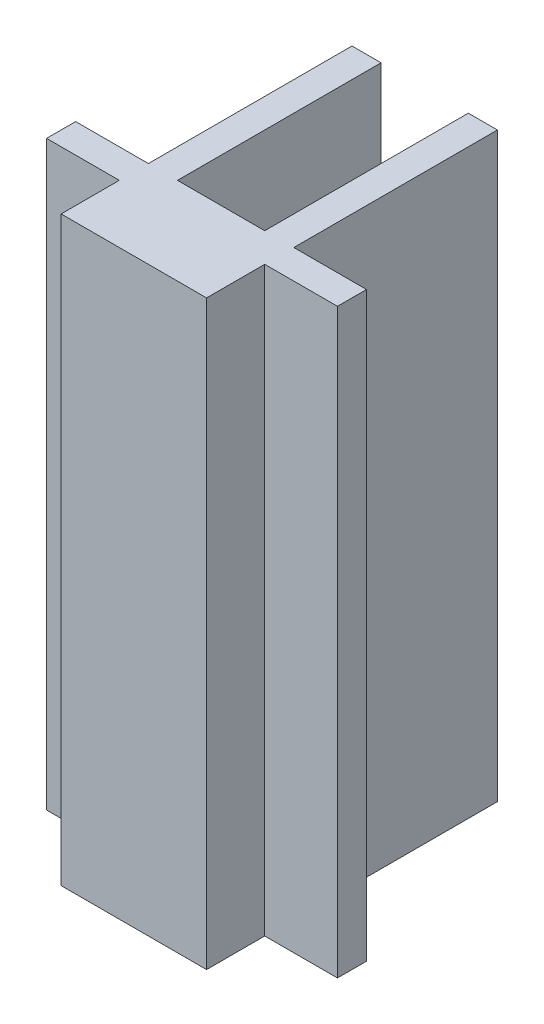
ISO-10303-21;
HEADER;
FILE_DESCRIPTION(('STEP AP214'),'2;1');
FILE_NAME('part.step','',(''),(''),'','','');
FILE_SCHEMA(('AUTOMOTIVE_DESIGN { 1 0 10303 214 1 1 1 1 }'));
ENDSEC;
DATA;
#1=APPLICATION_CONTEXT('core data for automotive mechanical design processes');
#2=APPLICATION_PROTOCOL_DEFINITION('international standard','automotive_design',2000,#1);
#3=PRODUCT_CONTEXT('',#1,'mechanical');
#4=PRODUCT('Part','Part','',(#3));
#5=PRODUCT_RELATED_PRODUCT_CATEGORY('part','',(#4));
#6=PRODUCT_DEFINITION_FORMATION('','',#4);
#7=PRODUCT_DEFINITION_CONTEXT('part definition',#1,'design');
#8=PRODUCT_DEFINITION('design','',#6,#7);
#9=PRODUCT_DEFINITION_SHAPE('','',#8);
#10=(LENGTH_UNIT() NAMED_UNIT(*) SI_UNIT(.MILLI.,.METRE.));
#11=(NAMED_UNIT(*) PLANE_ANGLE_UNIT() SI_UNIT($,.RADIAN.));
#12=(NAMED_UNIT(*) SI_UNIT($,.STERADIAN.) SOLID_ANGLE_UNIT());
#13=UNCERTAINTY_MEASURE_WITH_UNIT(LENGTH_MEASURE(1.E-05),#10,'distance_accuracy_value','');
#14=(GEOMETRIC_REPRESENTATION_CONTEXT(3) GLOBAL_UNCERTAINTY_ASSIGNED_CONTEXT((#13)) GLOBAL_UNIT_ASSIGNED_CONTEXT((#10,
#11,#12)) REPRESENTATION_CONTEXT('',''));
#15=CARTESIAN_POINT('',(0.,0.,0.));
#16=DIRECTION('',(0.,0.,1.));
#17=DIRECTION('',(1.,0.,0.));
#18=AXIS2_PLACEMENT_3D('',#15,#16,#17);
#19=CARTESIAN_POINT('',(30.,200.,0.));
#20=DIRECTION('',(-1.,0.,0.));
#21=DIRECTION('',(0.,0.,1.));
#22=AXIS2_PLACEMENT_3D('',#19,#20,#21);
#23=PLANE('',#22);
#24=DIRECTION('',(0.,0.,-1.));
#25=VECTOR('',#24,1.);
#26=CARTESIAN_POINT('',(30.,0.,0.));
#27=LINE('',#26,#25);
#28=CARTESIAN_POINT('',(30.,0.,40.));
#29=VERTEX_POINT('',#28);
#30=CARTESIAN_POINT('',(30.,0.,30.));
#31=VERTEX_POINT('',#30);
#32=EDGE_CURVE('E212',#29,#31,#27,.T.);
#33=ORIENTED_EDGE('',*,*,#32,.T.);
#34=DIRECTION('',(0.,-1.,0.));
#35=VECTOR('',#34,1.);
#36=CARTESIAN_POINT('',(30.,200.,30.));
#37=LINE('',#36,#35);
#38=CARTESIAN_POINT('',(30.,200.,30.));
#39=VERTEX_POINT('',#38);
#40=EDGE_CURVE('E117',#39,#31,#37,.T.);
#41=ORIENTED_EDGE('',*,*,#40,.F.);
#42=DIRECTION('',(0.,0.,-1.));
#43=VECTOR('',#42,1.);
#44=CARTESIAN_POINT('',(30.,200.,0.));
#45=LINE('',#44,#43);
#46=CARTESIAN_POINT('',(30.,200.,40.));
#47=VERTEX_POINT('',#46);
#48=EDGE_CURVE('E201',#47,#39,#45,.T.);
#49=ORIENTED_EDGE('',*,*,#48,.F.);
#50=DIRECTION('',(0.,-1.,0.));
#51=VECTOR('',#50,1.);
#52=CARTESIAN_POINT('',(30.,200.,40.));
#53=LINE('',#52,#51);
#54=EDGE_CURVE('E12',#47,#29,#53,.T.);
#55=ORIENTED_EDGE('',*,*,#54,.T.);
#56=EDGE_LOOP('',(#33,#41,#49,#55));
#57=FACE_BOUND('',#56,.T.);
#58=ADVANCED_FACE('F107',(#57),#23,.F.);
#59=CARTESIAN_POINT('',(0.,200.,30.));
#60=DIRECTION('',(0.,0.,-1.));
#61=DIRECTION('',(-1.,0.,0.));
#62=AXIS2_PLACEMENT_3D('',#59,#60,#61);
#63=PLANE('',#62);
#64=DIRECTION('',(1.,0.,0.));
#65=VECTOR('',#64,1.);
#66=CARTESIAN_POINT('',(0.,0.,30.));
#67=LINE('',#66,#65);
#68=CARTESIAN_POINT('',(5.,0.,30.));
#69=VERTEX_POINT('',#68);
#70=EDGE_CURVE('E229',#69,#31,#67,.T.);
#71=ORIENTED_EDGE('',*,*,#70,.F.);
#72=DIRECTION('',(0.,-1.,0.));
#73=VECTOR('',#72,1.);
#74=CARTESIAN_POINT('',(5.,200.,30.));
#75=LINE('',#74,#73);
#76=CARTESIAN_POINT('',(5.,200.,30.));
#77=VERTEX_POINT('',#76);
#78=EDGE_CURVE('E216',#77,#69,#75,.T.);
#79=ORIENTED_EDGE('',*,*,#78,.F.);
#80=DIRECTION('',(1.,0.,0.));
#81=VECTOR('',#80,1.);
#82=CARTESIAN_POINT('',(0.,200.,30.));
#83=LINE('',#82,#81);
#84=EDGE_CURVE('E205',#77,#39,#83,.T.);
#85=ORIENTED_EDGE('',*,*,#84,.T.);
#86=ORIENTED_EDGE('',*,*,#40,.T.);
#87=EDGE_LOOP('',(#71,#79,#85,#86));
#88=FACE_BOUND('',#87,.T.);
#89=ADVANCED_FACE('F218',(#88),#63,.T.);
#90=CARTESIAN_POINT('',(0.,200.,40.));
#91=DIRECTION('',(0.,0.,-1.));
#92=DIRECTION('',(-1.,0.,0.));
#93=AXIS2_PLACEMENT_3D('',#90,#91,#92);
#94=PLANE('',#93);
#95=DIRECTION('',(1.,0.,0.));
#96=VECTOR('',#95,1.);
#97=CARTESIAN_POINT('',(0.,0.,40.));
#98=LINE('',#97,#96);
#99=CARTESIAN_POINT('',(5.,0.,40.));
#100=VERTEX_POINT('',#99);
#101=EDGE_CURVE('E224',#100,#29,#98,.T.);
#102=ORIENTED_EDGE('',*,*,#101,.T.);
#103=ORIENTED_EDGE('',*,*,#54,.F.);
#104=DIRECTION('',(1.,0.,0.));
#105=VECTOR('',#104,1.);
#106=CARTESIAN_POINT('',(0.,200.,40.));
#107=LINE('',#106,#105);
#108=CARTESIAN_POINT('',(5.,200.,40.));
#109=VERTEX_POINT('',#108);
#110=EDGE_CURVE('E207',#109,#47,#107,.T.);
#111=ORIENTED_EDGE('',*,*,#110,.F.);
#112=DIRECTION('',(0.,-1.,0.));
#113=VECTOR('',#112,1.);
#114=CARTESIAN_POINT('',(5.,200.,40.));
#115=LINE('',#114,#113);
#116=EDGE_CURVE('E126',#109,#100,#115,.T.);
#117=ORIENTED_EDGE('',*,*,#116,.T.);
#118=EDGE_LOOP('',(#102,#103,#111,#117));
#119=FACE_BOUND('',#118,.T.);
#120=ADVANCED_FACE('F280',(#119),#94,.F.);
#121=CARTESIAN_POINT('',(0.,0.,0.));
#122=DIRECTION('',(0.,1.,0.));
#123=DIRECTION('',(0.,0.,1.));
#124=AXIS2_PLACEMENT_3D('',#121,#122,#123);
#125=PLANE('',#124);
#126=ORIENTED_EDGE('',*,*,#101,.F.);
#127=DIRECTION('',(0.,0.,1.));
#128=VECTOR('',#127,1.);
#129=CARTESIAN_POINT('',(5.,0.,30.));
#130=LINE('',#129,#128);
#131=CARTESIAN_POINT('',(5.,0.,60.));
#132=VERTEX_POINT('',#131);
#133=EDGE_CURVE('E171',#100,#132,#130,.T.);
#134=ORIENTED_EDGE('',*,*,#133,.T.);
#135=DIRECTION('',(-1.,0.,0.));
#136=VECTOR('',#135,1.);
#137=CARTESIAN_POINT('',(5.,0.,60.));
#138=LINE('',#137,#136);
#139=CARTESIAN_POINT('',(-45.,0.,60.));
#140=VERTEX_POINT('',#139);
#141=EDGE_CURVE('E282',#132,#140,#138,.T.);
#142=ORIENTED_EDGE('',*,*,#141,.T.);
#143=DIRECTION('',(0.,0.,-1.));
#144=VECTOR('',#143,1.);
#145=CARTESIAN_POINT('',(-45.,0.,0.));
#146=LINE('',#145,#144);
#147=CARTESIAN_POINT('',(-45.,0.,40.));
#148=VERTEX_POINT('',#147);
#149=EDGE_CURVE('E326',#140,#148,#146,.T.);
#150=ORIENTED_EDGE('',*,*,#149,.T.);
#151=DIRECTION('',(-1.,0.,0.));
#152=VECTOR('',#151,1.);
#153=CARTESIAN_POINT('',(-40.,0.,40.));
#154=LINE('',#153,#152);
#155=CARTESIAN_POINT('',(-70.,0.,40.));
#156=VERTEX_POINT('',#155);
#157=EDGE_CURVE('E319',#148,#156,#154,.T.);
#158=ORIENTED_EDGE('',*,*,#157,.T.);
#159=DIRECTION('',(0.,0.,-1.));
#160=VECTOR('',#159,1.);
#161=CARTESIAN_POINT('',(-70.,0.,0.));
#162=LINE('',#161,#160);
#163=CARTESIAN_POINT('',(-70.,0.,30.));
#164=VERTEX_POINT('',#163);
#165=EDGE_CURVE('E399',#156,#164,#162,.T.);
#166=ORIENTED_EDGE('',*,*,#165,.T.);
#167=DIRECTION('',(-1.,0.,0.));
#168=VECTOR('',#167,1.);
#169=CARTESIAN_POINT('',(-40.,0.,30.));
#170=LINE('',#169,#168);
#171=CARTESIAN_POINT('',(-45.,0.,30.));
#172=VERTEX_POINT('',#171);
#173=EDGE_CURVE('E407',#172,#164,#170,.T.);
#174=ORIENTED_EDGE('',*,*,#173,.F.);
#175=CARTESIAN_POINT('',(-45.,0.,-40.));
#176=VERTEX_POINT('',#175);
#177=EDGE_CURVE('E331',#172,#176,#146,.T.);
#178=ORIENTED_EDGE('',*,*,#177,.T.);
#179=DIRECTION('',(-1.,0.,0.));
#180=VECTOR('',#179,1.);
#181=CARTESIAN_POINT('',(-40.,0.,-40.));
#182=LINE('',#181,#180);
#183=CARTESIAN_POINT('',(-35.,0.,-40.));
#184=VERTEX_POINT('',#183);
#185=EDGE_CURVE('E343',#184,#176,#182,.T.);
#186=ORIENTED_EDGE('',*,*,#185,.F.);
#187=DIRECTION('',(0.,0.,-1.));
#188=VECTOR('',#187,1.);
#189=CARTESIAN_POINT('',(-35.,0.,0.));
#190=LINE('',#189,#188);
#191=CARTESIAN_POINT('',(-35.,0.,30.));
#192=VERTEX_POINT('',#191);
#193=EDGE_CURVE('E352',#192,#184,#190,.T.);
#194=ORIENTED_EDGE('',*,*,#193,.F.);
#195=DIRECTION('',(-1.,0.,0.));
#196=VECTOR('',#195,1.);
#197=CARTESIAN_POINT('',(5.,0.,30.));
#198=LINE('',#197,#196);
#199=CARTESIAN_POINT('',(-5.,0.,30.));
#200=VERTEX_POINT('',#199);
#201=EDGE_CURVE('E268',#200,#192,#198,.T.);
#202=ORIENTED_EDGE('',*,*,#201,.F.);
#203=DIRECTION('',(0.,0.,-1.));
#204=VECTOR('',#203,1.);
#205=CARTESIAN_POINT('',(-5.,0.,0.));
#206=LINE('',#205,#204);
#207=CARTESIAN_POINT('',(-5.,0.,-40.));
#208=VERTEX_POINT('',#207);
#209=EDGE_CURVE('E235',#200,#208,#206,.T.);
#210=ORIENTED_EDGE('',*,*,#209,.T.);
#211=DIRECTION('',(1.,0.,0.));
#212=VECTOR('',#211,1.);
#213=CARTESIAN_POINT('',(0.,0.,-40.));
#214=LINE('',#213,#212);
#215=CARTESIAN_POINT('',(5.,0.,-40.));
#216=VERTEX_POINT('',#215);
#217=EDGE_CURVE('E242',#208,#216,#214,.T.);
#218=ORIENTED_EDGE('',*,*,#217,.T.);
#219=DIRECTION('',(0.,0.,-1.));
#220=VECTOR('',#219,1.);
#221=CARTESIAN_POINT('',(5.,0.,0.));
#222=LINE('',#221,#220);
#223=EDGE_CURVE('E239',#69,#216,#222,.T.);
#224=ORIENTED_EDGE('',*,*,#223,.F.);
#225=ORIENTED_EDGE('',*,*,#70,.T.);
#226=ORIENTED_EDGE('',*,*,#32,.F.);
#227=EDGE_LOOP('',(#126,#134,#142,#150,#158,#166,#174,#178,#186,#194,#202,#210,#218,#224,#225,#226));
#228=FACE_BOUND('',#227,.T.);
#229=ADVANCED_FACE('F263',(#228),#125,.F.);
#230=CARTESIAN_POINT('',(0.,200.,0.));
#231=DIRECTION('',(0.,1.,0.));
#232=DIRECTION('',(0.,0.,1.));
#233=AXIS2_PLACEMENT_3D('',#230,#231,#232);
#234=PLANE('',#233);
#235=ORIENTED_EDGE('',*,*,#110,.T.);
#236=ORIENTED_EDGE('',*,*,#48,.T.);
#237=ORIENTED_EDGE('',*,*,#84,.F.);
#238=DIRECTION('',(0.,0.,-1.));
#239=VECTOR('',#238,1.);
#240=CARTESIAN_POINT('',(5.,200.,0.));
#241=LINE('',#240,#239);
#242=CARTESIAN_POINT('',(5.,200.,-40.));
#243=VERTEX_POINT('',#242);
#244=EDGE_CURVE('E232',#77,#243,#241,.T.);
#245=ORIENTED_EDGE('',*,*,#244,.T.);
#246=DIRECTION('',(1.,0.,0.));
#247=VECTOR('',#246,1.);
#248=CARTESIAN_POINT('',(0.,200.,-40.));
#249=LINE('',#248,#247);
#250=CARTESIAN_POINT('',(-5.,200.,-40.));
#251=VERTEX_POINT('',#250);
#252=EDGE_CURVE('E234',#251,#243,#249,.T.);
#253=ORIENTED_EDGE('',*,*,#252,.F.);
#254=DIRECTION('',(0.,0.,-1.));
#255=VECTOR('',#254,1.);
#256=CARTESIAN_POINT('',(-5.,200.,0.));
#257=LINE('',#256,#255);
#258=CARTESIAN_POINT('',(-5.,200.,30.));
#259=VERTEX_POINT('',#258);
#260=EDGE_CURVE('E238',#259,#251,#257,.T.);
#261=ORIENTED_EDGE('',*,*,#260,.F.);
#262=DIRECTION('',(-1.,0.,0.));
#263=VECTOR('',#262,1.);
#264=CARTESIAN_POINT('',(5.,200.,30.));
#265=LINE('',#264,#263);
#266=CARTESIAN_POINT('',(-35.,200.,30.));
#267=VERTEX_POINT('',#266);
#268=EDGE_CURVE('E254',#259,#267,#265,.T.);
#269=ORIENTED_EDGE('',*,*,#268,.T.);
#270=DIRECTION('',(0.,0.,-1.));
#271=VECTOR('',#270,1.);
#272=CARTESIAN_POINT('',(-35.,200.,0.));
#273=LINE('',#272,#271);
#274=CARTESIAN_POINT('',(-35.,200.,-40.));
#275=VERTEX_POINT('',#274);
#276=EDGE_CURVE('E311',#267,#275,#273,.T.);
#277=ORIENTED_EDGE('',*,*,#276,.T.);
#278=DIRECTION('',(-1.,0.,0.));
#279=VECTOR('',#278,1.);
#280=CARTESIAN_POINT('',(-40.,200.,-40.));
#281=LINE('',#280,#279);
#282=CARTESIAN_POINT('',(-45.,200.,-40.));
#283=VERTEX_POINT('',#282);
#284=EDGE_CURVE('E325',#275,#283,#281,.T.);
#285=ORIENTED_EDGE('',*,*,#284,.T.);
#286=DIRECTION('',(0.,0.,-1.));
#287=VECTOR('',#286,1.);
#288=CARTESIAN_POINT('',(-45.,200.,0.));
#289=LINE('',#288,#287);
#290=CARTESIAN_POINT('',(-45.,200.,30.));
#291=VERTEX_POINT('',#290);
#292=EDGE_CURVE('E328',#291,#283,#289,.T.);
#293=ORIENTED_EDGE('',*,*,#292,.F.);
#294=DIRECTION('',(-1.,0.,0.));
#295=VECTOR('',#294,1.);
#296=CARTESIAN_POINT('',(-40.,200.,30.));
#297=LINE('',#296,#295);
#298=CARTESIAN_POINT('',(-70.,200.,30.));
#299=VERTEX_POINT('',#298);
#300=EDGE_CURVE('E391',#291,#299,#297,.T.);
#301=ORIENTED_EDGE('',*,*,#300,.T.);
#302=DIRECTION('',(0.,0.,-1.));
#303=VECTOR('',#302,1.);
#304=CARTESIAN_POINT('',(-70.,200.,0.));
#305=LINE('',#304,#303);
#306=CARTESIAN_POINT('',(-70.,200.,40.));
#307=VERTEX_POINT('',#306);
#308=EDGE_CURVE('E396',#307,#299,#305,.T.);
#309=ORIENTED_EDGE('',*,*,#308,.F.);
#310=DIRECTION('',(-1.,0.,0.));
#311=VECTOR('',#310,1.);
#312=CARTESIAN_POINT('',(-40.,200.,40.));
#313=LINE('',#312,#311);
#314=CARTESIAN_POINT('',(-45.,200.,40.));
#315=VERTEX_POINT('',#314);
#316=EDGE_CURVE('E397',#315,#307,#313,.T.);
#317=ORIENTED_EDGE('',*,*,#316,.F.);
#318=CARTESIAN_POINT('',(-45.,200.,60.));
#319=VERTEX_POINT('',#318);
#320=EDGE_CURVE('E349',#319,#315,#289,.T.);
#321=ORIENTED_EDGE('',*,*,#320,.F.);
#322=DIRECTION('',(-1.,0.,0.));
#323=VECTOR('',#322,1.);
#324=CARTESIAN_POINT('',(5.,200.,60.));
#325=LINE('',#324,#323);
#326=CARTESIAN_POINT('',(5.,200.,60.));
#327=VERTEX_POINT('',#326);
#328=EDGE_CURVE('E297',#327,#319,#325,.T.);
#329=ORIENTED_EDGE('',*,*,#328,.F.);
#330=DIRECTION('',(0.,0.,1.));
#331=VECTOR('',#330,1.);
#332=CARTESIAN_POINT('',(5.,200.,30.));
#333=LINE('',#332,#331);
#334=EDGE_CURVE('E164',#109,#327,#333,.T.);
#335=ORIENTED_EDGE('',*,*,#334,.F.);
#336=EDGE_LOOP('',(#235,#236,#237,#245,#253,#261,#269,#277,#285,#293,#301,#309,#317,#321,#329,#335));
#337=FACE_BOUND('',#336,.T.);
#338=ADVANCED_FACE('F203',(#337),#234,.T.);
#339=CARTESIAN_POINT('',(-5.,200.,0.));
#340=DIRECTION('',(-1.,0.,0.));
#341=DIRECTION('',(0.,0.,1.));
#342=AXIS2_PLACEMENT_3D('',#339,#340,#341);
#343=PLANE('',#342);
#344=ORIENTED_EDGE('',*,*,#209,.F.);
#345=DIRECTION('',(0.,-1.,0.));
#346=VECTOR('',#345,1.);
#347=CARTESIAN_POINT('',(-5.,200.,30.));
#348=LINE('',#347,#346);
#349=EDGE_CURVE('E251',#259,#200,#348,.T.);
#350=ORIENTED_EDGE('',*,*,#349,.F.);
#351=ORIENTED_EDGE('',*,*,#260,.T.);
#352=DIRECTION('',(0.,-1.,0.));
#353=VECTOR('',#352,1.);
#354=CARTESIAN_POINT('',(-5.,200.,-40.));
#355=LINE('',#354,#353);
#356=EDGE_CURVE('E248',#251,#208,#355,.T.);
#357=ORIENTED_EDGE('',*,*,#356,.T.);
#358=EDGE_LOOP('',(#344,#350,#351,#357));
#359=FACE_BOUND('',#358,.T.);
#360=ADVANCED_FACE('F270',(#359),#343,.T.);
#361=CARTESIAN_POINT('',(0.,200.,-40.));
#362=DIRECTION('',(0.,0.,-1.));
#363=DIRECTION('',(-1.,0.,0.));
#364=AXIS2_PLACEMENT_3D('',#361,#362,#363);
#365=PLANE('',#364);
#366=ORIENTED_EDGE('',*,*,#217,.F.);
#367=ORIENTED_EDGE('',*,*,#356,.F.);
#368=ORIENTED_EDGE('',*,*,#252,.T.);
#369=DIRECTION('',(0.,-1.,0.));
#370=VECTOR('',#369,1.);
#371=CARTESIAN_POINT('',(5.,200.,-40.));
#372=LINE('',#371,#370);
#373=EDGE_CURVE('E227',#243,#216,#372,.T.);
#374=ORIENTED_EDGE('',*,*,#373,.T.);
#375=EDGE_LOOP('',(#366,#367,#368,#374));
#376=FACE_BOUND('',#375,.T.);
#377=ADVANCED_FACE('F275',(#376),#365,.T.);
#378=CARTESIAN_POINT('',(5.,200.,30.));
#379=DIRECTION('',(0.,0.,1.));
#380=DIRECTION('',(1.,0.,0.));
#381=AXIS2_PLACEMENT_3D('',#378,#379,#380);
#382=PLANE('',#381);
#383=ORIENTED_EDGE('',*,*,#268,.F.);
#384=ORIENTED_EDGE('',*,*,#349,.T.);
#385=ORIENTED_EDGE('',*,*,#201,.T.);
#386=DIRECTION('',(0.,-1.,0.));
#387=VECTOR('',#386,1.);
#388=CARTESIAN_POINT('',(-35.,200.,30.));
#389=LINE('',#388,#387);
#390=EDGE_CURVE('E315',#267,#192,#389,.T.);
#391=ORIENTED_EDGE('',*,*,#390,.F.);
#392=EDGE_LOOP('',(#383,#384,#385,#391));
#393=FACE_BOUND('',#392,.T.);
#394=ADVANCED_FACE('F316',(#393),#382,.F.);
#395=CARTESIAN_POINT('',(5.,200.,60.));
#396=DIRECTION('',(0.,0.,1.));
#397=DIRECTION('',(1.,0.,0.));
#398=AXIS2_PLACEMENT_3D('',#395,#396,#397);
#399=PLANE('',#398);
#400=ORIENTED_EDGE('',*,*,#141,.F.);
#401=DIRECTION('',(0.,-1.,0.));
#402=VECTOR('',#401,1.);
#403=CARTESIAN_POINT('',(5.,200.,60.));
#404=LINE('',#403,#402);
#405=EDGE_CURVE('E243',#327,#132,#404,.T.);
#406=ORIENTED_EDGE('',*,*,#405,.F.);
#407=ORIENTED_EDGE('',*,*,#328,.T.);
#408=DIRECTION('',(0.,-1.,0.));
#409=VECTOR('',#408,1.);
#410=CARTESIAN_POINT('',(-45.,200.,60.));
#411=LINE('',#410,#409);
#412=EDGE_CURVE('E353',#319,#140,#411,.T.);
#413=ORIENTED_EDGE('',*,*,#412,.T.);
#414=EDGE_LOOP('',(#400,#406,#407,#413));
#415=FACE_BOUND('',#414,.T.);
#416=ADVANCED_FACE('F452',(#415),#399,.T.);
#417=CARTESIAN_POINT('',(5.,200.,30.));
#418=DIRECTION('',(1.,0.,0.));
#419=DIRECTION('',(0.,0.,-1.));
#420=AXIS2_PLACEMENT_3D('',#417,#418,#419);
#421=PLANE('',#420);
#422=ORIENTED_EDGE('',*,*,#116,.F.);
#423=ORIENTED_EDGE('',*,*,#334,.T.);
#424=ORIENTED_EDGE('',*,*,#405,.T.);
#425=ORIENTED_EDGE('',*,*,#133,.F.);
#426=EDGE_LOOP('',(#422,#423,#424,#425));
#427=FACE_BOUND('',#426,.T.);
#428=ADVANCED_FACE('F109',(#427),#421,.T.);
#429=CARTESIAN_POINT('',(5.,200.,0.));
#430=DIRECTION('',(-1.,0.,0.));
#431=DIRECTION('',(0.,0.,1.));
#432=AXIS2_PLACEMENT_3D('',#429,#430,#431);
#433=PLANE('',#432);
#434=ORIENTED_EDGE('',*,*,#223,.T.);
#435=ORIENTED_EDGE('',*,*,#373,.F.);
#436=ORIENTED_EDGE('',*,*,#244,.F.);
#437=ORIENTED_EDGE('',*,*,#78,.T.);
#438=EDGE_LOOP('',(#434,#435,#436,#437));
#439=FACE_BOUND('',#438,.T.);
#440=ADVANCED_FACE('F278',(#439),#433,.F.);
#441=CARTESIAN_POINT('',(-40.,200.,40.));
#442=DIRECTION('',(0.,0.,1.));
#443=DIRECTION('',(1.,0.,0.));
#444=AXIS2_PLACEMENT_3D('',#441,#442,#443);
#445=PLANE('',#444);
#446=ORIENTED_EDGE('',*,*,#157,.F.);
#447=DIRECTION('',(0.,-1.,0.));
#448=VECTOR('',#447,1.);
#449=CARTESIAN_POINT('',(-45.,200.,40.));
#450=LINE('',#449,#448);
#451=EDGE_CURVE('E283',#315,#148,#450,.T.);
#452=ORIENTED_EDGE('',*,*,#451,.F.);
#453=ORIENTED_EDGE('',*,*,#316,.T.);
#454=DIRECTION('',(0.,-1.,0.));
#455=VECTOR('',#454,1.);
#456=CARTESIAN_POINT('',(-70.,200.,40.));
#457=LINE('',#456,#455);
#458=EDGE_CURVE('E179',#307,#156,#457,.T.);
#459=ORIENTED_EDGE('',*,*,#458,.T.);
#460=EDGE_LOOP('',(#446,#452,#453,#459));
#461=FACE_BOUND('',#460,.T.);
#462=ADVANCED_FACE('F423',(#461),#445,.T.);
#463=CARTESIAN_POINT('',(-40.,200.,30.));
#464=DIRECTION('',(0.,0.,1.));
#465=DIRECTION('',(1.,0.,0.));
#466=AXIS2_PLACEMENT_3D('',#463,#464,#465);
#467=PLANE('',#466);
#468=ORIENTED_EDGE('',*,*,#173,.T.);
#469=DIRECTION('',(0.,-1.,0.));
#470=VECTOR('',#469,1.);
#471=CARTESIAN_POINT('',(-70.,200.,30.));
#472=LINE('',#471,#470);
#473=EDGE_CURVE('E394',#299,#164,#472,.T.);
#474=ORIENTED_EDGE('',*,*,#473,.F.);
#475=ORIENTED_EDGE('',*,*,#300,.F.);
#476=DIRECTION('',(0.,-1.,0.));
#477=VECTOR('',#476,1.);
#478=CARTESIAN_POINT('',(-45.,200.,30.));
#479=LINE('',#478,#477);
#480=EDGE_CURVE('E287',#291,#172,#479,.T.);
#481=ORIENTED_EDGE('',*,*,#480,.T.);
#482=EDGE_LOOP('',(#468,#474,#475,#481));
#483=FACE_BOUND('',#482,.T.);
#484=ADVANCED_FACE('F393',(#483),#467,.F.);
#485=CARTESIAN_POINT('',(-70.,200.,0.));
#486=DIRECTION('',(-1.,0.,0.));
#487=DIRECTION('',(0.,0.,1.));
#488=AXIS2_PLACEMENT_3D('',#485,#486,#487);
#489=PLANE('',#488);
#490=ORIENTED_EDGE('',*,*,#165,.F.);
#491=ORIENTED_EDGE('',*,*,#458,.F.);
#492=ORIENTED_EDGE('',*,*,#308,.T.);
#493=ORIENTED_EDGE('',*,*,#473,.T.);
#494=EDGE_LOOP('',(#490,#491,#492,#493));
#495=FACE_BOUND('',#494,.T.);
#496=ADVANCED_FACE('F425',(#495),#489,.T.);
#497=CARTESIAN_POINT('',(-45.,200.,0.));
#498=DIRECTION('',(-1.,0.,0.));
#499=DIRECTION('',(0.,0.,1.));
#500=AXIS2_PLACEMENT_3D('',#497,#498,#499);
#501=PLANE('',#500);
#502=ORIENTED_EDGE('',*,*,#480,.F.);
#503=ORIENTED_EDGE('',*,*,#292,.T.);
#504=DIRECTION('',(0.,-1.,0.));
#505=VECTOR('',#504,1.);
#506=CARTESIAN_POINT('',(-45.,200.,-40.));
#507=LINE('',#506,#505);
#508=EDGE_CURVE('E345',#283,#176,#507,.T.);
#509=ORIENTED_EDGE('',*,*,#508,.T.);
#510=ORIENTED_EDGE('',*,*,#177,.F.);
#511=EDGE_LOOP('',(#502,#503,#509,#510));
#512=FACE_BOUND('',#511,.T.);
#513=ADVANCED_FACE('F371',(#512),#501,.T.);
#514=CARTESIAN_POINT('',(-35.,200.,0.));
#515=DIRECTION('',(-1.,0.,0.));
#516=DIRECTION('',(0.,0.,1.));
#517=AXIS2_PLACEMENT_3D('',#514,#515,#516);
#518=PLANE('',#517);
#519=ORIENTED_EDGE('',*,*,#193,.T.);
#520=DIRECTION('',(0.,-1.,0.));
#521=VECTOR('',#520,1.);
#522=CARTESIAN_POINT('',(-35.,200.,-40.));
#523=LINE('',#522,#521);
#524=EDGE_CURVE('E320',#275,#184,#523,.T.);
#525=ORIENTED_EDGE('',*,*,#524,.F.);
#526=ORIENTED_EDGE('',*,*,#276,.F.);
#527=ORIENTED_EDGE('',*,*,#390,.T.);
#528=EDGE_LOOP('',(#519,#525,#526,#527));
#529=FACE_BOUND('',#528,.T.);
#530=ADVANCED_FACE('F322',(#529),#518,.F.);
#531=CARTESIAN_POINT('',(-40.,200.,-40.));
#532=DIRECTION('',(0.,0.,1.));
#533=DIRECTION('',(1.,0.,0.));
#534=AXIS2_PLACEMENT_3D('',#531,#532,#533);
#535=PLANE('',#534);
#536=ORIENTED_EDGE('',*,*,#185,.T.);
#537=ORIENTED_EDGE('',*,*,#508,.F.);
#538=ORIENTED_EDGE('',*,*,#284,.F.);
#539=ORIENTED_EDGE('',*,*,#524,.T.);
#540=EDGE_LOOP('',(#536,#537,#538,#539));
#541=FACE_BOUND('',#540,.T.);
#542=ADVANCED_FACE('F377',(#541),#535,.F.);
#543=ORIENTED_EDGE('',*,*,#320,.T.);
#544=ORIENTED_EDGE('',*,*,#451,.T.);
#545=ORIENTED_EDGE('',*,*,#149,.F.);
#546=ORIENTED_EDGE('',*,*,#412,.F.);
#547=EDGE_LOOP('',(#543,#544,#545,#546));
#548=FACE_BOUND('',#547,.T.);
#549=ADVANCED_FACE('F433',(#548),#501,.T.);
#550=CLOSED_SHELL('',(#58,#89,#120,#229,#338,#360,#377,#394,#416,#428,#440,#462,#484,#496,#513,
#530,#542,#549));
#551=MANIFOLD_SOLID_BREP('B2',#550);
#552=ADVANCED_BREP_SHAPE_REPRESENTATION('',(#18,#551),#14);
#553=SHAPE_DEFINITION_REPRESENTATION(#9,#552);
ENDSEC;
END-ISO-10303-21;
